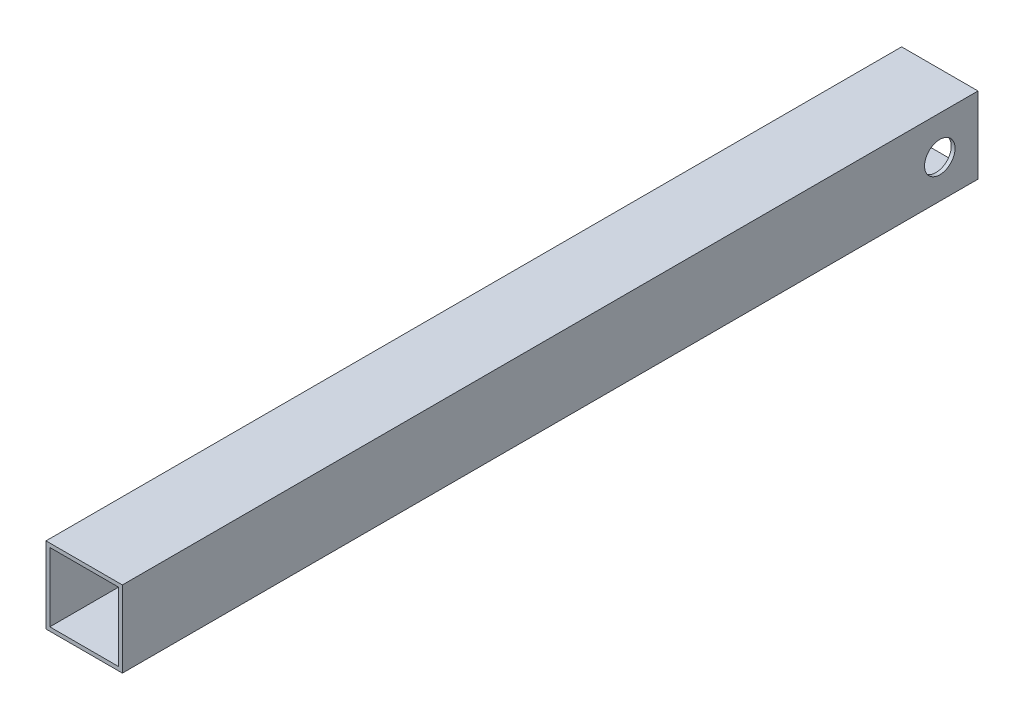
ISO-10303-21;
HEADER;
FILE_DESCRIPTION(('STEP AP214'),'2;1');
FILE_NAME('part.step','',(''),(''),'','','');
FILE_SCHEMA(('AUTOMOTIVE_DESIGN { 1 0 10303 214 1 1 1 1 }'));
ENDSEC;
DATA;
#1=APPLICATION_CONTEXT('core data for automotive mechanical design processes');
#2=APPLICATION_PROTOCOL_DEFINITION('international standard','automotive_design',2000,#1);
#3=PRODUCT_CONTEXT('',#1,'mechanical');
#4=PRODUCT('Part','Part','',(#3));
#5=PRODUCT_RELATED_PRODUCT_CATEGORY('part','',(#4));
#6=PRODUCT_DEFINITION_FORMATION('','',#4);
#7=PRODUCT_DEFINITION_CONTEXT('part definition',#1,'design');
#8=PRODUCT_DEFINITION('design','',#6,#7);
#9=PRODUCT_DEFINITION_SHAPE('','',#8);
#10=(LENGTH_UNIT() NAMED_UNIT(*) SI_UNIT(.MILLI.,.METRE.));
#11=(NAMED_UNIT(*) PLANE_ANGLE_UNIT() SI_UNIT($,.RADIAN.));
#12=(NAMED_UNIT(*) SI_UNIT($,.STERADIAN.) SOLID_ANGLE_UNIT());
#13=UNCERTAINTY_MEASURE_WITH_UNIT(LENGTH_MEASURE(1.E-05),#10,'distance_accuracy_value','');
#14=(GEOMETRIC_REPRESENTATION_CONTEXT(3) GLOBAL_UNCERTAINTY_ASSIGNED_CONTEXT((#13)) GLOBAL_UNIT_ASSIGNED_CONTEXT((#10,
#11,#12)) REPRESENTATION_CONTEXT('',''));
#15=CARTESIAN_POINT('',(0.,0.,0.));
#16=DIRECTION('',(0.,0.,1.));
#17=DIRECTION('',(1.,0.,0.));
#18=AXIS2_PLACEMENT_3D('',#15,#16,#17);
#19=CARTESIAN_POINT('',(0.,0.,355.6));
#20=DIRECTION('',(0.,0.,-1.));
#21=DIRECTION('',(-1.,0.,0.));
#22=AXIS2_PLACEMENT_3D('',#19,#20,#21);
#23=PLANE('',#22);
#24=DIRECTION('',(0.,1.,0.));
#25=VECTOR('',#24,1.);
#26=CARTESIAN_POINT('',(31.75,-31.75,355.6));
#27=LINE('',#26,#25);
#28=CARTESIAN_POINT('',(31.75,-31.75,355.6));
#29=VERTEX_POINT('',#28);
#30=CARTESIAN_POINT('',(31.75,31.75,355.6));
#31=VERTEX_POINT('',#30);
#32=EDGE_CURVE('E156',#29,#31,#27,.T.);
#33=ORIENTED_EDGE('',*,*,#32,.T.);
#34=DIRECTION('',(-1.,0.,0.));
#35=VECTOR('',#34,1.);
#36=CARTESIAN_POINT('',(-31.75,31.75,355.6));
#37=LINE('',#36,#35);
#38=CARTESIAN_POINT('',(-31.75,31.75,355.6));
#39=VERTEX_POINT('',#38);
#40=EDGE_CURVE('E160',#31,#39,#37,.T.);
#41=ORIENTED_EDGE('',*,*,#40,.T.);
#42=DIRECTION('',(0.,-1.,0.));
#43=VECTOR('',#42,1.);
#44=CARTESIAN_POINT('',(-31.75,-31.75,355.6));
#45=LINE('',#44,#43);
#46=CARTESIAN_POINT('',(-31.75,-31.75,355.6));
#47=VERTEX_POINT('',#46);
#48=EDGE_CURVE('E164',#39,#47,#45,.T.);
#49=ORIENTED_EDGE('',*,*,#48,.T.);
#50=DIRECTION('',(1.,0.,0.));
#51=VECTOR('',#50,1.);
#52=CARTESIAN_POINT('',(-31.75,-31.75,355.6));
#53=LINE('',#52,#51);
#54=EDGE_CURVE('E167',#47,#29,#53,.T.);
#55=ORIENTED_EDGE('',*,*,#54,.T.);
#56=EDGE_LOOP('',(#33,#41,#49,#55));
#57=FACE_BOUND('',#56,.T.);
#58=DIRECTION('',(0.,1.,0.));
#59=VECTOR('',#58,1.);
#60=CARTESIAN_POINT('',(28.575,-28.575,355.6));
#61=LINE('',#60,#59);
#62=CARTESIAN_POINT('',(28.575,-28.575,355.6));
#63=VERTEX_POINT('',#62);
#64=CARTESIAN_POINT('',(28.575,28.575,355.6));
#65=VERTEX_POINT('',#64);
#66=EDGE_CURVE('E106',#63,#65,#61,.T.);
#67=ORIENTED_EDGE('',*,*,#66,.F.);
#68=DIRECTION('',(1.,0.,0.));
#69=VECTOR('',#68,1.);
#70=CARTESIAN_POINT('',(-28.575,-28.575,355.6));
#71=LINE('',#70,#69);
#72=CARTESIAN_POINT('',(-28.575,-28.575,355.6));
#73=VERTEX_POINT('',#72);
#74=EDGE_CURVE('E132',#73,#63,#71,.T.);
#75=ORIENTED_EDGE('',*,*,#74,.F.);
#76=DIRECTION('',(0.,-1.,0.));
#77=VECTOR('',#76,1.);
#78=CARTESIAN_POINT('',(-28.575,-28.575,355.6));
#79=LINE('',#78,#77);
#80=CARTESIAN_POINT('',(-28.575,28.575,355.6));
#81=VERTEX_POINT('',#80);
#82=EDGE_CURVE('E128',#81,#73,#79,.T.);
#83=ORIENTED_EDGE('',*,*,#82,.F.);
#84=DIRECTION('',(-1.,0.,0.));
#85=VECTOR('',#84,1.);
#86=CARTESIAN_POINT('',(-28.575,28.575,355.6));
#87=LINE('',#86,#85);
#88=EDGE_CURVE('E115',#65,#81,#87,.T.);
#89=ORIENTED_EDGE('',*,*,#88,.F.);
#90=EDGE_LOOP('',(#67,#75,#83,#89));
#91=FACE_BOUND('',#90,.T.);
#92=ADVANCED_FACE('F39',(#57,#91),#23,.F.);
#93=CARTESIAN_POINT('',(0.,0.,-355.6));
#94=DIRECTION('',(0.,0.,-1.));
#95=DIRECTION('',(-1.,0.,0.));
#96=AXIS2_PLACEMENT_3D('',#93,#94,#95);
#97=PLANE('',#96);
#98=DIRECTION('',(0.,1.,0.));
#99=VECTOR('',#98,1.);
#100=CARTESIAN_POINT('',(31.75,-31.75,-355.6));
#101=LINE('',#100,#99);
#102=CARTESIAN_POINT('',(31.75,-31.75,-355.6));
#103=VERTEX_POINT('',#102);
#104=CARTESIAN_POINT('',(31.75,31.75,-355.6));
#105=VERTEX_POINT('',#104);
#106=EDGE_CURVE('E124',#103,#105,#101,.T.);
#107=ORIENTED_EDGE('',*,*,#106,.F.);
#108=DIRECTION('',(1.,0.,0.));
#109=VECTOR('',#108,1.);
#110=CARTESIAN_POINT('',(-31.75,-31.75,-355.6));
#111=LINE('',#110,#109);
#112=CARTESIAN_POINT('',(-31.75,-31.75,-355.6));
#113=VERTEX_POINT('',#112);
#114=EDGE_CURVE('E161',#113,#103,#111,.T.);
#115=ORIENTED_EDGE('',*,*,#114,.F.);
#116=DIRECTION('',(0.,-1.,0.));
#117=VECTOR('',#116,1.);
#118=CARTESIAN_POINT('',(-31.75,-31.75,-355.6));
#119=LINE('',#118,#117);
#120=CARTESIAN_POINT('',(-31.75,31.75,-355.6));
#121=VERTEX_POINT('',#120);
#122=EDGE_CURVE('E177',#121,#113,#119,.T.);
#123=ORIENTED_EDGE('',*,*,#122,.F.);
#124=DIRECTION('',(-1.,0.,0.));
#125=VECTOR('',#124,1.);
#126=CARTESIAN_POINT('',(-31.75,31.75,-355.6));
#127=LINE('',#126,#125);
#128=EDGE_CURVE('E174',#105,#121,#127,.T.);
#129=ORIENTED_EDGE('',*,*,#128,.F.);
#130=EDGE_LOOP('',(#107,#115,#123,#129));
#131=FACE_BOUND('',#130,.T.);
#132=DIRECTION('',(1.,0.,0.));
#133=VECTOR('',#132,1.);
#134=CARTESIAN_POINT('',(-28.575,-28.575,-355.6));
#135=LINE('',#134,#133);
#136=CARTESIAN_POINT('',(-28.575,-28.575,-355.6));
#137=VERTEX_POINT('',#136);
#138=CARTESIAN_POINT('',(28.575,-28.575,-355.6));
#139=VERTEX_POINT('',#138);
#140=EDGE_CURVE('E116',#137,#139,#135,.T.);
#141=ORIENTED_EDGE('',*,*,#140,.T.);
#142=DIRECTION('',(0.,1.,0.));
#143=VECTOR('',#142,1.);
#144=CARTESIAN_POINT('',(28.575,-28.575,-355.6));
#145=LINE('',#144,#143);
#146=CARTESIAN_POINT('',(28.575,28.575,-355.6));
#147=VERTEX_POINT('',#146);
#148=EDGE_CURVE('E64',#139,#147,#145,.T.);
#149=ORIENTED_EDGE('',*,*,#148,.T.);
#150=DIRECTION('',(-1.,0.,0.));
#151=VECTOR('',#150,1.);
#152=CARTESIAN_POINT('',(-28.575,28.575,-355.6));
#153=LINE('',#152,#151);
#154=CARTESIAN_POINT('',(-28.575,28.575,-355.6));
#155=VERTEX_POINT('',#154);
#156=EDGE_CURVE('E122',#147,#155,#153,.T.);
#157=ORIENTED_EDGE('',*,*,#156,.T.);
#158=DIRECTION('',(0.,-1.,0.));
#159=VECTOR('',#158,1.);
#160=CARTESIAN_POINT('',(-28.575,-28.575,-355.6));
#161=LINE('',#160,#159);
#162=EDGE_CURVE('E143',#155,#137,#161,.T.);
#163=ORIENTED_EDGE('',*,*,#162,.T.);
#164=EDGE_LOOP('',(#141,#149,#157,#163));
#165=FACE_BOUND('',#164,.T.);
#166=ADVANCED_FACE('F201',(#131,#165),#97,.T.);
#167=CARTESIAN_POINT('',(31.75,-31.75,355.6));
#168=DIRECTION('',(-1.,0.,0.));
#169=DIRECTION('',(0.,0.,1.));
#170=AXIS2_PLACEMENT_3D('',#167,#168,#169);
#171=PLANE('',#170);
#172=CARTESIAN_POINT('',(31.75,0.,-323.85));
#173=DIRECTION('',(-1.,0.,0.));
#174=DIRECTION('',(0.,0.,1.));
#175=AXIS2_PLACEMENT_3D('',#172,#173,#174);
#176=CIRCLE('',#175,12.7);
#177=CARTESIAN_POINT('',(31.75,0.,-311.15));
#178=VERTEX_POINT('',#177);
#179=EDGE_CURVE('E247',#178,#178,#176,.T.);
#180=ORIENTED_EDGE('',*,*,#179,.T.);
#181=EDGE_LOOP('',(#180));
#182=FACE_BOUND('',#181,.T.);
#183=ORIENTED_EDGE('',*,*,#106,.T.);
#184=DIRECTION('',(0.,0.,-1.));
#185=VECTOR('',#184,1.);
#186=CARTESIAN_POINT('',(31.75,31.75,355.6));
#187=LINE('',#186,#185);
#188=EDGE_CURVE('E11',#31,#105,#187,.T.);
#189=ORIENTED_EDGE('',*,*,#188,.F.);
#190=ORIENTED_EDGE('',*,*,#32,.F.);
#191=DIRECTION('',(0.,0.,-1.));
#192=VECTOR('',#191,1.);
#193=CARTESIAN_POINT('',(31.75,-31.75,355.6));
#194=LINE('',#193,#192);
#195=EDGE_CURVE('E170',#29,#103,#194,.T.);
#196=ORIENTED_EDGE('',*,*,#195,.T.);
#197=EDGE_LOOP('',(#183,#189,#190,#196));
#198=FACE_BOUND('',#197,.T.);
#199=ADVANCED_FACE('F41',(#182,#198),#171,.F.);
#200=CARTESIAN_POINT('',(-31.75,31.75,355.6));
#201=DIRECTION('',(0.,-1.,0.));
#202=DIRECTION('',(0.,0.,-1.));
#203=AXIS2_PLACEMENT_3D('',#200,#201,#202);
#204=PLANE('',#203);
#205=ORIENTED_EDGE('',*,*,#128,.T.);
#206=DIRECTION('',(0.,0.,-1.));
#207=VECTOR('',#206,1.);
#208=CARTESIAN_POINT('',(-31.75,31.75,355.6));
#209=LINE('',#208,#207);
#210=EDGE_CURVE('E49',#39,#121,#209,.T.);
#211=ORIENTED_EDGE('',*,*,#210,.F.);
#212=ORIENTED_EDGE('',*,*,#40,.F.);
#213=ORIENTED_EDGE('',*,*,#188,.T.);
#214=EDGE_LOOP('',(#205,#211,#212,#213));
#215=FACE_BOUND('',#214,.T.);
#216=ADVANCED_FACE('F211',(#215),#204,.F.);
#217=CARTESIAN_POINT('',(-31.75,-31.75,355.6));
#218=DIRECTION('',(1.,0.,0.));
#219=DIRECTION('',(0.,0.,-1.));
#220=AXIS2_PLACEMENT_3D('',#217,#218,#219);
#221=PLANE('',#220);
#222=CARTESIAN_POINT('',(-31.75,0.,-323.85));
#223=DIRECTION('',(-1.,0.,0.));
#224=DIRECTION('',(0.,0.,1.));
#225=AXIS2_PLACEMENT_3D('',#222,#223,#224);
#226=CIRCLE('',#225,12.7);
#227=CARTESIAN_POINT('',(-31.75,0.,-311.15));
#228=VERTEX_POINT('',#227);
#229=EDGE_CURVE('E249',#228,#228,#226,.T.);
#230=ORIENTED_EDGE('',*,*,#229,.F.);
#231=EDGE_LOOP('',(#230));
#232=FACE_BOUND('',#231,.T.);
#233=ORIENTED_EDGE('',*,*,#122,.T.);
#234=DIRECTION('',(0.,0.,-1.));
#235=VECTOR('',#234,1.);
#236=CARTESIAN_POINT('',(-31.75,-31.75,355.6));
#237=LINE('',#236,#235);
#238=EDGE_CURVE('E185',#47,#113,#237,.T.);
#239=ORIENTED_EDGE('',*,*,#238,.F.);
#240=ORIENTED_EDGE('',*,*,#48,.F.);
#241=ORIENTED_EDGE('',*,*,#210,.T.);
#242=EDGE_LOOP('',(#233,#239,#240,#241));
#243=FACE_BOUND('',#242,.T.);
#244=ADVANCED_FACE('F195',(#232,#243),#221,.F.);
#245=CARTESIAN_POINT('',(-31.75,-31.75,355.6));
#246=DIRECTION('',(0.,1.,0.));
#247=DIRECTION('',(0.,0.,1.));
#248=AXIS2_PLACEMENT_3D('',#245,#246,#247);
#249=PLANE('',#248);
#250=ORIENTED_EDGE('',*,*,#114,.T.);
#251=ORIENTED_EDGE('',*,*,#195,.F.);
#252=ORIENTED_EDGE('',*,*,#54,.F.);
#253=ORIENTED_EDGE('',*,*,#238,.T.);
#254=EDGE_LOOP('',(#250,#251,#252,#253));
#255=FACE_BOUND('',#254,.T.);
#256=ADVANCED_FACE('F205',(#255),#249,.F.);
#257=CARTESIAN_POINT('',(28.575,-28.575,355.6));
#258=DIRECTION('',(-1.,0.,0.));
#259=DIRECTION('',(0.,0.,1.));
#260=AXIS2_PLACEMENT_3D('',#257,#258,#259);
#261=PLANE('',#260);
#262=CARTESIAN_POINT('',(28.575,0.,-323.85));
#263=DIRECTION('',(-1.,0.,0.));
#264=DIRECTION('',(0.,0.,1.));
#265=AXIS2_PLACEMENT_3D('',#262,#263,#264);
#266=CIRCLE('',#265,12.7);
#267=CARTESIAN_POINT('',(28.575,0.,-311.15));
#268=VERTEX_POINT('',#267);
#269=EDGE_CURVE('E140',#268,#268,#266,.T.);
#270=ORIENTED_EDGE('',*,*,#269,.F.);
#271=EDGE_LOOP('',(#270));
#272=FACE_BOUND('',#271,.T.);
#273=ORIENTED_EDGE('',*,*,#148,.F.);
#274=DIRECTION('',(0.,0.,-1.));
#275=VECTOR('',#274,1.);
#276=CARTESIAN_POINT('',(28.575,-28.575,355.6));
#277=LINE('',#276,#275);
#278=EDGE_CURVE('E110',#63,#139,#277,.T.);
#279=ORIENTED_EDGE('',*,*,#278,.F.);
#280=ORIENTED_EDGE('',*,*,#66,.T.);
#281=DIRECTION('',(0.,0.,-1.));
#282=VECTOR('',#281,1.);
#283=CARTESIAN_POINT('',(28.575,28.575,355.6));
#284=LINE('',#283,#282);
#285=EDGE_CURVE('E109',#65,#147,#284,.T.);
#286=ORIENTED_EDGE('',*,*,#285,.T.);
#287=EDGE_LOOP('',(#273,#279,#280,#286));
#288=FACE_BOUND('',#287,.T.);
#289=ADVANCED_FACE('F108',(#272,#288),#261,.T.);
#290=CARTESIAN_POINT('',(-28.575,28.575,355.6));
#291=DIRECTION('',(0.,-1.,0.));
#292=DIRECTION('',(0.,0.,-1.));
#293=AXIS2_PLACEMENT_3D('',#290,#291,#292);
#294=PLANE('',#293);
#295=ORIENTED_EDGE('',*,*,#156,.F.);
#296=ORIENTED_EDGE('',*,*,#285,.F.);
#297=ORIENTED_EDGE('',*,*,#88,.T.);
#298=DIRECTION('',(0.,0.,-1.));
#299=VECTOR('',#298,1.);
#300=CARTESIAN_POINT('',(-28.575,28.575,355.6));
#301=LINE('',#300,#299);
#302=EDGE_CURVE('E125',#81,#155,#301,.T.);
#303=ORIENTED_EDGE('',*,*,#302,.T.);
#304=EDGE_LOOP('',(#295,#296,#297,#303));
#305=FACE_BOUND('',#304,.T.);
#306=ADVANCED_FACE('F119',(#305),#294,.T.);
#307=CARTESIAN_POINT('',(-28.575,-28.575,355.6));
#308=DIRECTION('',(1.,0.,0.));
#309=DIRECTION('',(0.,0.,-1.));
#310=AXIS2_PLACEMENT_3D('',#307,#308,#309);
#311=PLANE('',#310);
#312=CARTESIAN_POINT('',(-28.575,0.,-323.85));
#313=DIRECTION('',(1.,0.,0.));
#314=DIRECTION('',(0.,0.,-1.));
#315=AXIS2_PLACEMENT_3D('',#312,#313,#314);
#316=CIRCLE('',#315,12.7);
#317=CARTESIAN_POINT('',(-28.575,0.,-336.55));
#318=VERTEX_POINT('',#317);
#319=EDGE_CURVE('E43',#318,#318,#316,.T.);
#320=ORIENTED_EDGE('',*,*,#319,.F.);
#321=EDGE_LOOP('',(#320));
#322=FACE_BOUND('',#321,.T.);
#323=ORIENTED_EDGE('',*,*,#162,.F.);
#324=ORIENTED_EDGE('',*,*,#302,.F.);
#325=ORIENTED_EDGE('',*,*,#82,.T.);
#326=DIRECTION('',(0.,0.,-1.));
#327=VECTOR('',#326,1.);
#328=CARTESIAN_POINT('',(-28.575,-28.575,355.6));
#329=LINE('',#328,#327);
#330=EDGE_CURVE('E56',#73,#137,#329,.T.);
#331=ORIENTED_EDGE('',*,*,#330,.T.);
#332=EDGE_LOOP('',(#323,#324,#325,#331));
#333=FACE_BOUND('',#332,.T.);
#334=ADVANCED_FACE('F240',(#322,#333),#311,.T.);
#335=CARTESIAN_POINT('',(-28.575,-28.575,355.6));
#336=DIRECTION('',(0.,1.,0.));
#337=DIRECTION('',(0.,0.,1.));
#338=AXIS2_PLACEMENT_3D('',#335,#336,#337);
#339=PLANE('',#338);
#340=ORIENTED_EDGE('',*,*,#140,.F.);
#341=ORIENTED_EDGE('',*,*,#330,.F.);
#342=ORIENTED_EDGE('',*,*,#74,.T.);
#343=ORIENTED_EDGE('',*,*,#278,.T.);
#344=EDGE_LOOP('',(#340,#341,#342,#343));
#345=FACE_BOUND('',#344,.T.);
#346=ADVANCED_FACE('F264',(#345),#339,.T.);
#347=CARTESIAN_POINT('',(31.75,0.,-323.85));
#348=DIRECTION('',(-1.,0.,0.));
#349=DIRECTION('',(0.,0.,1.));
#350=AXIS2_PLACEMENT_3D('',#347,#348,#349);
#351=CYLINDRICAL_SURFACE('',#350,12.7);
#352=ORIENTED_EDGE('',*,*,#319,.T.);
#353=EDGE_LOOP('',(#352));
#354=FACE_BOUND('',#353,.T.);
#355=ORIENTED_EDGE('',*,*,#229,.T.);
#356=EDGE_LOOP('',(#355));
#357=FACE_BOUND('',#356,.T.);
#358=ADVANCED_FACE('F259',(#354,#357),#351,.F.);
#359=ORIENTED_EDGE('',*,*,#269,.T.);
#360=EDGE_LOOP('',(#359));
#361=FACE_BOUND('',#360,.T.);
#362=ORIENTED_EDGE('',*,*,#179,.F.);
#363=EDGE_LOOP('',(#362));
#364=FACE_BOUND('',#363,.T.);
#365=ADVANCED_FACE('F257',(#361,#364),#351,.F.);
#366=CLOSED_SHELL('',(#92,#166,#199,#216,#244,#256,#289,#306,#334,#346,#358,#365));
#367=MANIFOLD_SOLID_BREP('B2',#366);
#368=ADVANCED_BREP_SHAPE_REPRESENTATION('',(#18,#367),#14);
#369=SHAPE_DEFINITION_REPRESENTATION(#9,#368);
ENDSEC;
END-ISO-10303-21;
